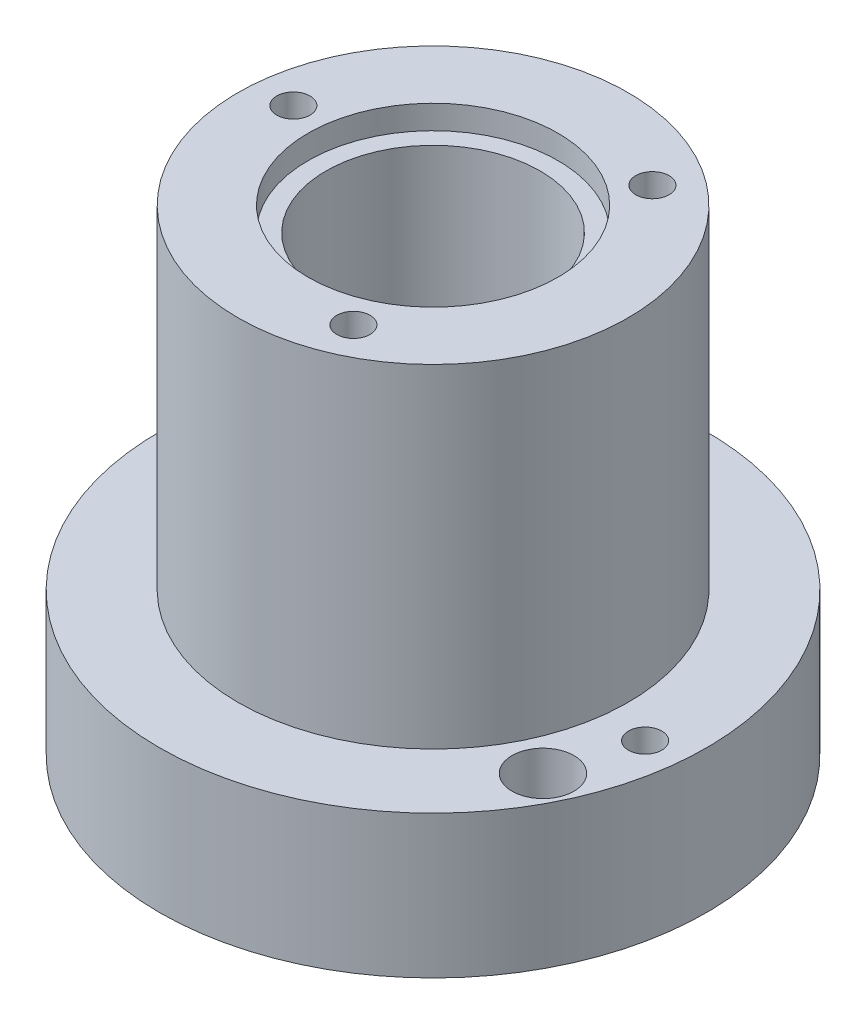
ISO-10303-21;
HEADER;
FILE_DESCRIPTION(('STEP AP214'),'2;1');
FILE_NAME('part.step','',(''),(''),'','','');
FILE_SCHEMA(('AUTOMOTIVE_DESIGN { 1 0 10303 214 1 1 1 1 }'));
ENDSEC;
DATA;
#1=APPLICATION_CONTEXT('core data for automotive mechanical design processes');
#2=APPLICATION_PROTOCOL_DEFINITION('international standard','automotive_design',2000,#1);
#3=PRODUCT_CONTEXT('',#1,'mechanical');
#4=PRODUCT('Part','Part','',(#3));
#5=PRODUCT_RELATED_PRODUCT_CATEGORY('part','',(#4));
#6=PRODUCT_DEFINITION_FORMATION('','',#4);
#7=PRODUCT_DEFINITION_CONTEXT('part definition',#1,'design');
#8=PRODUCT_DEFINITION('design','',#6,#7);
#9=PRODUCT_DEFINITION_SHAPE('','',#8);
#10=(LENGTH_UNIT() NAMED_UNIT(*) SI_UNIT(.MILLI.,.METRE.));
#11=(NAMED_UNIT(*) PLANE_ANGLE_UNIT() SI_UNIT($,.RADIAN.));
#12=(NAMED_UNIT(*) SI_UNIT($,.STERADIAN.) SOLID_ANGLE_UNIT());
#13=UNCERTAINTY_MEASURE_WITH_UNIT(LENGTH_MEASURE(1.E-05),#10,'distance_accuracy_value','');
#14=(GEOMETRIC_REPRESENTATION_CONTEXT(3) GLOBAL_UNCERTAINTY_ASSIGNED_CONTEXT((#13)) GLOBAL_UNIT_ASSIGNED_CONTEXT((#10,
#11,#12)) REPRESENTATION_CONTEXT('',''));
#15=CARTESIAN_POINT('',(0.,0.,0.));
#16=DIRECTION('',(0.,0.,1.));
#17=DIRECTION('',(1.,0.,0.));
#18=AXIS2_PLACEMENT_3D('',#15,#16,#17);
#19=CARTESIAN_POINT('',(13.0281539228037,25.4,14.3830452707903));
#20=DIRECTION('',(0.,-1.,0.));
#21=DIRECTION('',(0.,0.,-1.));
#22=AXIS2_PLACEMENT_3D('',#19,#20,#21);
#23=CYLINDRICAL_SURFACE('',#22,14.605);
#24=CARTESIAN_POINT('',(13.0281539228037,0.,14.3830452707903));
#25=DIRECTION('',(0.,1.,0.));
#26=DIRECTION('',(0.,0.,1.));
#27=AXIS2_PLACEMENT_3D('',#24,#25,#26);
#28=CIRCLE('',#27,14.605);
#29=CARTESIAN_POINT('',(13.0281539228037,0.,28.9880452707903));
#30=VERTEX_POINT('',#29);
#31=EDGE_CURVE('E12',#30,#30,#28,.T.);
#32=ORIENTED_EDGE('',*,*,#31,.T.);
#33=EDGE_LOOP('',(#32));
#34=FACE_BOUND('',#33,.T.);
#35=CARTESIAN_POINT('',(13.0281539228037,7.62,14.3830452707903));
#36=DIRECTION('',(0.,1.,0.));
#37=DIRECTION('',(0.,0.,1.));
#38=AXIS2_PLACEMENT_3D('',#35,#36,#37);
#39=CIRCLE('',#38,14.605);
#40=CARTESIAN_POINT('',(13.0281539228037,7.62,28.9880452707903));
#41=VERTEX_POINT('',#40);
#42=EDGE_CURVE('E141',#41,#41,#39,.T.);
#43=ORIENTED_EDGE('',*,*,#42,.F.);
#44=EDGE_LOOP('',(#43));
#45=FACE_BOUND('',#44,.T.);
#46=ADVANCED_FACE('F40',(#34,#45),#23,.T.);
#47=CARTESIAN_POINT('',(13.0281539228037,25.4,14.3830452707903));
#48=DIRECTION('',(0.,1.,0.));
#49=DIRECTION('',(0.,0.,1.));
#50=AXIS2_PLACEMENT_3D('',#47,#48,#49);
#51=PLANE('',#50);
#52=CARTESIAN_POINT('',(16.4348390463682,25.4,22.0415320971081));
#53=DIRECTION('',(0.,1.,0.));
#54=DIRECTION('',(0.,0.,1.));
#55=AXIS2_PLACEMENT_3D('',#52,#53,#54);
#56=CIRCLE('',#55,0.889000000000001);
#57=CARTESIAN_POINT('',(16.4348390463682,25.4,22.9305320971081));
#58=VERTEX_POINT('',#57);
#59=EDGE_CURVE('E119',#58,#58,#56,.T.);
#60=ORIENTED_EDGE('',*,*,#59,.F.);
#61=EDGE_LOOP('',(#60));
#62=FACE_BOUND('',#61,.T.);
#63=CARTESIAN_POINT('',(17.9572555071611,25.4,7.60352599792991));
#64=DIRECTION('',(0.,1.,0.));
#65=DIRECTION('',(0.,0.,1.));
#66=AXIS2_PLACEMENT_3D('',#63,#64,#65);
#67=CIRCLE('',#66,0.889000000000001);
#68=CARTESIAN_POINT('',(17.9572555071611,25.4,8.49252599792991));
#69=VERTEX_POINT('',#68);
#70=EDGE_CURVE('E125',#69,#69,#67,.T.);
#71=ORIENTED_EDGE('',*,*,#70,.F.);
#72=EDGE_LOOP('',(#71));
#73=FACE_BOUND('',#72,.T.);
#74=CARTESIAN_POINT('',(4.69236721488166,25.4,13.5040777173328));
#75=DIRECTION('',(0.,1.,0.));
#76=DIRECTION('',(0.,0.,1.));
#77=AXIS2_PLACEMENT_3D('',#74,#75,#76);
#78=CIRCLE('',#77,0.889);
#79=CARTESIAN_POINT('',(4.69236721488166,25.4,14.3930777173328));
#80=VERTEX_POINT('',#79);
#81=EDGE_CURVE('E131',#80,#80,#78,.T.);
#82=ORIENTED_EDGE('',*,*,#81,.F.);
#83=EDGE_LOOP('',(#82));
#84=FACE_BOUND('',#83,.T.);
#85=CARTESIAN_POINT('',(13.0281539228037,25.4,14.3830452707903));
#86=DIRECTION('',(0.,1.,0.));
#87=DIRECTION('',(0.,0.,1.));
#88=AXIS2_PLACEMENT_3D('',#85,#86,#87);
#89=CIRCLE('',#88,6.6675);
#90=CARTESIAN_POINT('',(13.0281539228037,25.4,21.0505452707903));
#91=VERTEX_POINT('',#90);
#92=EDGE_CURVE('E148',#91,#91,#89,.T.);
#93=ORIENTED_EDGE('',*,*,#92,.F.);
#94=EDGE_LOOP('',(#93));
#95=FACE_BOUND('',#94,.T.);
#96=CARTESIAN_POINT('',(13.0281539228037,25.4,14.3830452707903));
#97=DIRECTION('',(0.,1.,0.));
#98=DIRECTION('',(0.,0.,1.));
#99=AXIS2_PLACEMENT_3D('',#96,#97,#98);
#100=CIRCLE('',#99,10.414);
#101=CARTESIAN_POINT('',(13.0281539228037,25.4,24.7970452707903));
#102=VERTEX_POINT('',#101);
#103=EDGE_CURVE('E137',#102,#102,#100,.T.);
#104=ORIENTED_EDGE('',*,*,#103,.T.);
#105=EDGE_LOOP('',(#104));
#106=FACE_BOUND('',#105,.T.);
#107=ADVANCED_FACE('F174',(#62,#73,#84,#95,#106),#51,.T.);
#108=CARTESIAN_POINT('',(13.0281539228037,0.,14.3830452707903));
#109=DIRECTION('',(0.,1.,0.));
#110=DIRECTION('',(0.,0.,1.));
#111=AXIS2_PLACEMENT_3D('',#108,#109,#110);
#112=CYLINDRICAL_SURFACE('',#111,5.715);
#113=CARTESIAN_POINT('',(13.0281539228037,0.,14.3830452707903));
#114=DIRECTION('',(0.,1.,0.));
#115=DIRECTION('',(0.,0.,1.));
#116=AXIS2_PLACEMENT_3D('',#113,#114,#115);
#117=CIRCLE('',#116,5.715);
#118=CARTESIAN_POINT('',(13.0281539228037,0.,20.0980452707903));
#119=VERTEX_POINT('',#118);
#120=EDGE_CURVE('E48',#119,#119,#117,.T.);
#121=ORIENTED_EDGE('',*,*,#120,.F.);
#122=EDGE_LOOP('',(#121));
#123=FACE_BOUND('',#122,.T.);
#124=CARTESIAN_POINT('',(13.0281539228037,24.13,14.3830452707903));
#125=DIRECTION('',(0.,1.,0.));
#126=DIRECTION('',(0.,0.,1.));
#127=AXIS2_PLACEMENT_3D('',#124,#125,#126);
#128=CIRCLE('',#127,5.715);
#129=CARTESIAN_POINT('',(13.0281539228037,24.13,20.0980452707903));
#130=VERTEX_POINT('',#129);
#131=EDGE_CURVE('E147',#130,#130,#128,.F.);
#132=ORIENTED_EDGE('',*,*,#131,.F.);
#133=EDGE_LOOP('',(#132));
#134=FACE_BOUND('',#133,.T.);
#135=ADVANCED_FACE('F179',(#123,#134),#112,.F.);
#136=CARTESIAN_POINT('',(13.0281539228037,0.,14.3830452707903));
#137=DIRECTION('',(0.,1.,0.));
#138=DIRECTION('',(0.,0.,1.));
#139=AXIS2_PLACEMENT_3D('',#136,#137,#138);
#140=PLANE('',#139);
#141=CARTESIAN_POINT('',(25.6601759592949,0.,15.6953025891544));
#142=DIRECTION('',(0.,-1.,0.));
#143=DIRECTION('',(0.,0.,-1.));
#144=AXIS2_PLACEMENT_3D('',#141,#142,#143);
#145=CIRCLE('',#144,0.888999999999987);
#146=CARTESIAN_POINT('',(25.6601759592949,0.,14.8063025891544));
#147=VERTEX_POINT('',#146);
#148=EDGE_CURVE('E278',#147,#147,#145,.T.);
#149=ORIENTED_EDGE('',*,*,#148,.F.);
#150=EDGE_LOOP('',(#149));
#151=FACE_BOUND('',#150,.T.);
#152=CARTESIAN_POINT('',(0.396131886312438,0.,13.0707879524261));
#153=DIRECTION('',(0.,-1.,0.));
#154=DIRECTION('',(0.,0.,-1.));
#155=AXIS2_PLACEMENT_3D('',#152,#153,#154);
#156=CIRCLE('',#155,0.888999999999987);
#157=CARTESIAN_POINT('',(0.396131886312438,0.,12.1817879524261));
#158=VERTEX_POINT('',#157);
#159=EDGE_CURVE('E282',#158,#158,#156,.T.);
#160=ORIENTED_EDGE('',*,*,#159,.F.);
#161=EDGE_LOOP('',(#160));
#162=FACE_BOUND('',#161,.T.);
#163=CARTESIAN_POINT('',(5.82740256425499,0.,15.2376598659039));
#164=DIRECTION('',(0.,-1.,0.));
#165=DIRECTION('',(0.,0.,-1.));
#166=AXIS2_PLACEMENT_3D('',#163,#164,#165);
#167=CIRCLE('',#166,0.595629999999989);
#168=CARTESIAN_POINT('',(5.82740256425499,0.,14.6420298659039));
#169=VERTEX_POINT('',#168);
#170=EDGE_CURVE('E82',#169,#169,#167,.T.);
#171=ORIENTED_EDGE('',*,*,#170,.F.);
#172=EDGE_LOOP('',(#171));
#173=FACE_BOUND('',#172,.T.);
#174=CARTESIAN_POINT('',(5.82740256425499,0.,19.0476598659039));
#175=DIRECTION('',(0.,-1.,0.));
#176=DIRECTION('',(0.,0.,-1.));
#177=AXIS2_PLACEMENT_3D('',#174,#175,#176);
#178=CIRCLE('',#177,0.595629999999989);
#179=CARTESIAN_POINT('',(5.82740256425499,0.,18.4520298659039));
#180=VERTEX_POINT('',#179);
#181=EDGE_CURVE('E81',#180,#180,#178,.T.);
#182=ORIENTED_EDGE('',*,*,#181,.F.);
#183=EDGE_LOOP('',(#182));
#184=FACE_BOUND('',#183,.T.);
#185=CARTESIAN_POINT('',(5.82740256425499,0.,17.1426598659039));
#186=DIRECTION('',(0.,-1.,0.));
#187=DIRECTION('',(0.,0.,-1.));
#188=AXIS2_PLACEMENT_3D('',#185,#186,#187);
#189=CIRCLE('',#188,0.79375);
#190=CARTESIAN_POINT('',(5.82740256425499,0.,16.3489098659039));
#191=VERTEX_POINT('',#190);
#192=EDGE_CURVE('E94',#191,#191,#189,.T.);
#193=ORIENTED_EDGE('',*,*,#192,.F.);
#194=EDGE_LOOP('',(#193));
#195=FACE_BOUND('',#194,.T.);
#196=CARTESIAN_POINT('',(24.4495533797354,0.,19.9365697773716));
#197=DIRECTION('',(0.,-1.,0.));
#198=DIRECTION('',(0.,0.,1.));
#199=AXIS2_PLACEMENT_3D('',#196,#197,#198);
#200=CIRCLE('',#199,1.651);
#201=CARTESIAN_POINT('',(24.4495533797354,0.,18.2855697773716));
#202=VERTEX_POINT('',#201);
#203=EDGE_CURVE('E98',#202,#202,#200,.T.);
#204=ORIENTED_EDGE('',*,*,#203,.F.);
#205=EDGE_LOOP('',(#204));
#206=FACE_BOUND('',#205,.T.);
#207=CARTESIAN_POINT('',(1.60675446587194,0.,8.82952076420888));
#208=DIRECTION('',(0.,-1.,0.));
#209=DIRECTION('',(0.,0.,-1.));
#210=AXIS2_PLACEMENT_3D('',#207,#208,#209);
#211=CIRCLE('',#210,1.651);
#212=CARTESIAN_POINT('',(1.60675446587194,0.,7.17852076420888));
#213=VERTEX_POINT('',#212);
#214=EDGE_CURVE('E103',#213,#213,#211,.T.);
#215=ORIENTED_EDGE('',*,*,#214,.F.);
#216=EDGE_LOOP('',(#215));
#217=FACE_BOUND('',#216,.T.);
#218=CARTESIAN_POINT('',(17.8930413905689,0.,4.37789934651808));
#219=DIRECTION('',(0.,-1.,0.));
#220=DIRECTION('',(0.,0.,-1.));
#221=AXIS2_PLACEMENT_3D('',#218,#219,#220);
#222=CIRCLE('',#221,1.35255);
#223=CARTESIAN_POINT('',(17.8930413905689,0.,3.02534934651807));
#224=VERTEX_POINT('',#223);
#225=EDGE_CURVE('E107',#224,#224,#222,.T.);
#226=ORIENTED_EDGE('',*,*,#225,.F.);
#227=EDGE_LOOP('',(#226));
#228=FACE_BOUND('',#227,.T.);
#229=CARTESIAN_POINT('',(8.16326645503836,0.,24.3881911950625));
#230=DIRECTION('',(0.,-1.,0.));
#231=DIRECTION('',(0.,0.,-1.));
#232=AXIS2_PLACEMENT_3D('',#229,#230,#231);
#233=CIRCLE('',#232,1.35255);
#234=CARTESIAN_POINT('',(8.16326645503836,0.,23.0356411950624));
#235=VERTEX_POINT('',#234);
#236=EDGE_CURVE('E113',#235,#235,#233,.T.);
#237=ORIENTED_EDGE('',*,*,#236,.F.);
#238=EDGE_LOOP('',(#237));
#239=FACE_BOUND('',#238,.T.);
#240=ORIENTED_EDGE('',*,*,#120,.T.);
#241=EDGE_LOOP('',(#240));
#242=FACE_BOUND('',#241,.T.);
#243=ORIENTED_EDGE('',*,*,#31,.F.);
#244=EDGE_LOOP('',(#243));
#245=FACE_BOUND('',#244,.T.);
#246=ADVANCED_FACE('F184',(#151,#162,#173,#184,#195,#206,#217,#228,#239,#242,#245),#140,.F.);
#247=CARTESIAN_POINT('',(13.0281539228037,24.13,14.3830452707903));
#248=DIRECTION('',(0.,1.,0.));
#249=DIRECTION('',(0.,0.,1.));
#250=AXIS2_PLACEMENT_3D('',#247,#248,#249);
#251=PLANE('',#250);
#252=CARTESIAN_POINT('',(13.0281539228037,24.13,14.3830452707903));
#253=DIRECTION('',(0.,1.,0.));
#254=DIRECTION('',(0.,0.,1.));
#255=AXIS2_PLACEMENT_3D('',#252,#253,#254);
#256=CIRCLE('',#255,6.6675);
#257=CARTESIAN_POINT('',(13.0281539228037,24.13,21.0505452707903));
#258=VERTEX_POINT('',#257);
#259=EDGE_CURVE('E144',#258,#258,#256,.T.);
#260=ORIENTED_EDGE('',*,*,#259,.T.);
#261=EDGE_LOOP('',(#260));
#262=FACE_BOUND('',#261,.T.);
#263=ORIENTED_EDGE('',*,*,#131,.T.);
#264=EDGE_LOOP('',(#263));
#265=FACE_BOUND('',#264,.T.);
#266=ADVANCED_FACE('F186',(#262,#265),#251,.T.);
#267=CARTESIAN_POINT('',(13.0281539228037,24.13,14.3830452707903));
#268=DIRECTION('',(0.,1.,0.));
#269=DIRECTION('',(0.,0.,1.));
#270=AXIS2_PLACEMENT_3D('',#267,#268,#269);
#271=CYLINDRICAL_SURFACE('',#270,6.6675);
#272=ORIENTED_EDGE('',*,*,#259,.F.);
#273=EDGE_LOOP('',(#272));
#274=FACE_BOUND('',#273,.T.);
#275=ORIENTED_EDGE('',*,*,#92,.T.);
#276=EDGE_LOOP('',(#275));
#277=FACE_BOUND('',#276,.T.);
#278=ADVANCED_FACE('F166',(#274,#277),#271,.F.);
#279=CARTESIAN_POINT('',(13.0281539228037,7.62,14.3830452707903));
#280=DIRECTION('',(0.,1.,0.));
#281=DIRECTION('',(0.,0.,1.));
#282=AXIS2_PLACEMENT_3D('',#279,#280,#281);
#283=PLANE('',#282);
#284=CARTESIAN_POINT('',(25.6601759592949,7.62,15.6953025891544));
#285=DIRECTION('',(0.,1.,0.));
#286=DIRECTION('',(0.,0.,1.));
#287=AXIS2_PLACEMENT_3D('',#284,#285,#286);
#288=CIRCLE('',#287,0.888999999999992);
#289=CARTESIAN_POINT('',(25.6601759592949,7.62,16.5843025891544));
#290=VERTEX_POINT('',#289);
#291=EDGE_CURVE('E281',#290,#290,#288,.T.);
#292=ORIENTED_EDGE('',*,*,#291,.F.);
#293=EDGE_LOOP('',(#292));
#294=FACE_BOUND('',#293,.T.);
#295=CARTESIAN_POINT('',(0.396131886312438,7.62,13.0707879524261));
#296=DIRECTION('',(0.,1.,0.));
#297=DIRECTION('',(0.,0.,1.));
#298=AXIS2_PLACEMENT_3D('',#295,#296,#297);
#299=CIRCLE('',#298,0.888999999999993);
#300=CARTESIAN_POINT('',(0.396131886312438,7.62,13.9597879524261));
#301=VERTEX_POINT('',#300);
#302=EDGE_CURVE('E88',#301,#301,#299,.T.);
#303=ORIENTED_EDGE('',*,*,#302,.F.);
#304=EDGE_LOOP('',(#303));
#305=FACE_BOUND('',#304,.T.);
#306=CARTESIAN_POINT('',(24.4495533797354,7.62,19.9365697773716));
#307=DIRECTION('',(0.,1.,0.));
#308=DIRECTION('',(0.,0.,1.));
#309=AXIS2_PLACEMENT_3D('',#306,#307,#308);
#310=CIRCLE('',#309,1.651);
#311=CARTESIAN_POINT('',(24.4495533797354,7.62,18.2855697773716));
#312=VERTEX_POINT('',#311);
#313=EDGE_CURVE('E43',#312,#312,#310,.T.);
#314=ORIENTED_EDGE('',*,*,#313,.F.);
#315=EDGE_LOOP('',(#314));
#316=FACE_BOUND('',#315,.T.);
#317=CARTESIAN_POINT('',(1.60675446587194,7.62,8.82952076420888));
#318=DIRECTION('',(0.,1.,0.));
#319=DIRECTION('',(0.,0.,1.));
#320=AXIS2_PLACEMENT_3D('',#317,#318,#319);
#321=CIRCLE('',#320,1.651);
#322=CARTESIAN_POINT('',(1.60675446587194,7.62,7.17852076420888));
#323=VERTEX_POINT('',#322);
#324=EDGE_CURVE('E106',#323,#323,#321,.T.);
#325=ORIENTED_EDGE('',*,*,#324,.F.);
#326=EDGE_LOOP('',(#325));
#327=FACE_BOUND('',#326,.T.);
#328=CARTESIAN_POINT('',(13.0281539228037,7.62,14.3830452707903));
#329=DIRECTION('',(0.,1.,0.));
#330=DIRECTION('',(0.,0.,1.));
#331=AXIS2_PLACEMENT_3D('',#328,#329,#330);
#332=CIRCLE('',#331,10.414);
#333=CARTESIAN_POINT('',(13.0281539228037,7.62,24.7970452707903));
#334=VERTEX_POINT('',#333);
#335=EDGE_CURVE('E138',#334,#334,#332,.T.);
#336=ORIENTED_EDGE('',*,*,#335,.F.);
#337=EDGE_LOOP('',(#336));
#338=FACE_BOUND('',#337,.T.);
#339=ORIENTED_EDGE('',*,*,#42,.T.);
#340=EDGE_LOOP('',(#339));
#341=FACE_BOUND('',#340,.T.);
#342=ADVANCED_FACE('F162',(#294,#305,#316,#327,#338,#341),#283,.T.);
#343=CARTESIAN_POINT('',(13.0281539228037,7.62,14.3830452707903));
#344=DIRECTION('',(0.,1.,0.));
#345=DIRECTION('',(0.,0.,1.));
#346=AXIS2_PLACEMENT_3D('',#343,#344,#345);
#347=CYLINDRICAL_SURFACE('',#346,10.414);
#348=ORIENTED_EDGE('',*,*,#335,.T.);
#349=EDGE_LOOP('',(#348));
#350=FACE_BOUND('',#349,.T.);
#351=ORIENTED_EDGE('',*,*,#103,.F.);
#352=EDGE_LOOP('',(#351));
#353=FACE_BOUND('',#352,.T.);
#354=ADVANCED_FACE('F165',(#350,#353),#347,.T.);
#355=CARTESIAN_POINT('',(4.69236721488166,22.86,13.5040777173328));
#356=DIRECTION('',(0.,1.,0.));
#357=DIRECTION('',(0.,0.,1.));
#358=AXIS2_PLACEMENT_3D('',#355,#356,#357);
#359=CONICAL_SURFACE('',#358,0.888999999999999,1.02974425867665);
#360=CARTESIAN_POINT('',(4.69236721488166,22.3258349096845,13.5040777173328));
#361=VERTEX_POINT('',#360);
#362=VERTEX_LOOP('',#361);
#363=FACE_BOUND('',#362,.T.);
#364=CARTESIAN_POINT('',(4.69236721488166,22.86,13.5040777173328));
#365=DIRECTION('',(0.,1.,0.));
#366=DIRECTION('',(0.,0.,1.));
#367=AXIS2_PLACEMENT_3D('',#364,#365,#366);
#368=CIRCLE('',#367,0.888999999999999);
#369=CARTESIAN_POINT('',(4.69236721488166,22.86,14.3930777173328));
#370=VERTEX_POINT('',#369);
#371=EDGE_CURVE('E134',#370,#370,#368,.T.);
#372=ORIENTED_EDGE('',*,*,#371,.T.);
#373=EDGE_LOOP('',(#372));
#374=FACE_BOUND('',#373,.T.);
#375=ADVANCED_FACE('F205',(#363,#374),#359,.F.);
#376=CARTESIAN_POINT('',(4.69236721488166,25.4,13.5040777173328));
#377=DIRECTION('',(0.,1.,0.));
#378=DIRECTION('',(0.,0.,1.));
#379=AXIS2_PLACEMENT_3D('',#376,#377,#378);
#380=CYLINDRICAL_SURFACE('',#379,0.889);
#381=ORIENTED_EDGE('',*,*,#371,.F.);
#382=EDGE_LOOP('',(#381));
#383=FACE_BOUND('',#382,.T.);
#384=ORIENTED_EDGE('',*,*,#81,.T.);
#385=EDGE_LOOP('',(#384));
#386=FACE_BOUND('',#385,.T.);
#387=ADVANCED_FACE('F209',(#383,#386),#380,.F.);
#388=CARTESIAN_POINT('',(17.9572555071611,22.86,7.60352599792991));
#389=DIRECTION('',(0.,1.,0.));
#390=DIRECTION('',(0.,0.,1.));
#391=AXIS2_PLACEMENT_3D('',#388,#389,#390);
#392=CONICAL_SURFACE('',#391,0.889000000000001,1.02974425867665);
#393=CARTESIAN_POINT('',(17.9572555071611,22.3258349096845,7.60352599792991));
#394=VERTEX_POINT('',#393);
#395=VERTEX_LOOP('',#394);
#396=FACE_BOUND('',#395,.T.);
#397=CARTESIAN_POINT('',(17.9572555071611,22.86,7.60352599792991));
#398=DIRECTION('',(0.,1.,0.));
#399=DIRECTION('',(0.,0.,1.));
#400=AXIS2_PLACEMENT_3D('',#397,#398,#399);
#401=CIRCLE('',#400,0.889000000000001);
#402=CARTESIAN_POINT('',(17.9572555071611,22.86,8.49252599792991));
#403=VERTEX_POINT('',#402);
#404=EDGE_CURVE('E128',#403,#403,#401,.T.);
#405=ORIENTED_EDGE('',*,*,#404,.T.);
#406=EDGE_LOOP('',(#405));
#407=FACE_BOUND('',#406,.T.);
#408=ADVANCED_FACE('F212',(#396,#407),#392,.F.);
#409=CARTESIAN_POINT('',(17.9572555071611,25.4,7.60352599792991));
#410=DIRECTION('',(0.,1.,0.));
#411=DIRECTION('',(0.,0.,1.));
#412=AXIS2_PLACEMENT_3D('',#409,#410,#411);
#413=CYLINDRICAL_SURFACE('',#412,0.889000000000001);
#414=ORIENTED_EDGE('',*,*,#404,.F.);
#415=EDGE_LOOP('',(#414));
#416=FACE_BOUND('',#415,.T.);
#417=ORIENTED_EDGE('',*,*,#70,.T.);
#418=EDGE_LOOP('',(#417));
#419=FACE_BOUND('',#418,.T.);
#420=ADVANCED_FACE('F216',(#416,#419),#413,.F.);
#421=CARTESIAN_POINT('',(16.4348390463682,22.86,22.0415320971081));
#422=DIRECTION('',(0.,1.,0.));
#423=DIRECTION('',(0.,0.,1.));
#424=AXIS2_PLACEMENT_3D('',#421,#422,#423);
#425=CONICAL_SURFACE('',#424,0.889000000000001,1.02974425867665);
#426=CARTESIAN_POINT('',(16.4348390463682,22.3258349096845,22.0415320971081));
#427=VERTEX_POINT('',#426);
#428=VERTEX_LOOP('',#427);
#429=FACE_BOUND('',#428,.T.);
#430=CARTESIAN_POINT('',(16.4348390463682,22.86,22.0415320971081));
#431=DIRECTION('',(0.,1.,0.));
#432=DIRECTION('',(0.,0.,1.));
#433=AXIS2_PLACEMENT_3D('',#430,#431,#432);
#434=CIRCLE('',#433,0.889000000000001);
#435=CARTESIAN_POINT('',(16.4348390463682,22.86,22.9305320971081));
#436=VERTEX_POINT('',#435);
#437=EDGE_CURVE('E122',#436,#436,#434,.T.);
#438=ORIENTED_EDGE('',*,*,#437,.T.);
#439=EDGE_LOOP('',(#438));
#440=FACE_BOUND('',#439,.T.);
#441=ADVANCED_FACE('F219',(#429,#440),#425,.F.);
#442=CARTESIAN_POINT('',(16.4348390463682,25.4,22.0415320971081));
#443=DIRECTION('',(0.,1.,0.));
#444=DIRECTION('',(0.,0.,1.));
#445=AXIS2_PLACEMENT_3D('',#442,#443,#444);
#446=CYLINDRICAL_SURFACE('',#445,0.889000000000001);
#447=ORIENTED_EDGE('',*,*,#437,.F.);
#448=EDGE_LOOP('',(#447));
#449=FACE_BOUND('',#448,.T.);
#450=ORIENTED_EDGE('',*,*,#59,.T.);
#451=EDGE_LOOP('',(#450));
#452=FACE_BOUND('',#451,.T.);
#453=ADVANCED_FACE('F223',(#449,#452),#446,.F.);
#454=CARTESIAN_POINT('',(8.16326645503836,4.0005,24.3881911950625));
#455=DIRECTION('',(0.,-1.,0.));
#456=DIRECTION('',(0.,0.,-1.));
#457=AXIS2_PLACEMENT_3D('',#454,#455,#456);
#458=CONICAL_SURFACE('',#457,1.35255,1.02974425867665);
#459=CARTESIAN_POINT('',(8.16326645503836,4.81319403026573,24.3881911950625));
#460=VERTEX_POINT('',#459);
#461=VERTEX_LOOP('',#460);
#462=FACE_BOUND('',#461,.T.);
#463=CARTESIAN_POINT('',(8.16326645503836,4.0005,24.3881911950625));
#464=DIRECTION('',(0.,-1.,0.));
#465=DIRECTION('',(0.,0.,-1.));
#466=AXIS2_PLACEMENT_3D('',#463,#464,#465);
#467=CIRCLE('',#466,1.35255);
#468=CARTESIAN_POINT('',(8.16326645503836,4.0005,23.0356411950624));
#469=VERTEX_POINT('',#468);
#470=EDGE_CURVE('E116',#469,#469,#467,.T.);
#471=ORIENTED_EDGE('',*,*,#470,.T.);
#472=EDGE_LOOP('',(#471));
#473=FACE_BOUND('',#472,.T.);
#474=ADVANCED_FACE('F227',(#462,#473),#458,.F.);
#475=CARTESIAN_POINT('',(8.16326645503836,0.,24.3881911950625));
#476=DIRECTION('',(0.,-1.,0.));
#477=DIRECTION('',(0.,0.,-1.));
#478=AXIS2_PLACEMENT_3D('',#475,#476,#477);
#479=CYLINDRICAL_SURFACE('',#478,1.35255);
#480=ORIENTED_EDGE('',*,*,#470,.F.);
#481=EDGE_LOOP('',(#480));
#482=FACE_BOUND('',#481,.T.);
#483=ORIENTED_EDGE('',*,*,#236,.T.);
#484=EDGE_LOOP('',(#483));
#485=FACE_BOUND('',#484,.T.);
#486=ADVANCED_FACE('F231',(#482,#485),#479,.F.);
#487=CARTESIAN_POINT('',(17.8930413905689,4.0005,4.37789934651808));
#488=DIRECTION('',(0.,-1.,0.));
#489=DIRECTION('',(0.,0.,-1.));
#490=AXIS2_PLACEMENT_3D('',#487,#488,#489);
#491=CONICAL_SURFACE('',#490,1.35255,1.02974425867665);
#492=CARTESIAN_POINT('',(17.8930413905689,4.81319403026573,4.37789934651808));
#493=VERTEX_POINT('',#492);
#494=VERTEX_LOOP('',#493);
#495=FACE_BOUND('',#494,.T.);
#496=CARTESIAN_POINT('',(17.8930413905689,4.0005,4.37789934651808));
#497=DIRECTION('',(0.,-1.,0.));
#498=DIRECTION('',(0.,0.,-1.));
#499=AXIS2_PLACEMENT_3D('',#496,#497,#498);
#500=CIRCLE('',#499,1.35255);
#501=CARTESIAN_POINT('',(17.8930413905689,4.0005,3.02534934651808));
#502=VERTEX_POINT('',#501);
#503=EDGE_CURVE('E110',#502,#502,#500,.T.);
#504=ORIENTED_EDGE('',*,*,#503,.T.);
#505=EDGE_LOOP('',(#504));
#506=FACE_BOUND('',#505,.T.);
#507=ADVANCED_FACE('F235',(#495,#506),#491,.F.);
#508=CARTESIAN_POINT('',(17.8930413905689,0.,4.37789934651808));
#509=DIRECTION('',(0.,-1.,0.));
#510=DIRECTION('',(0.,0.,-1.));
#511=AXIS2_PLACEMENT_3D('',#508,#509,#510);
#512=CYLINDRICAL_SURFACE('',#511,1.35255);
#513=ORIENTED_EDGE('',*,*,#503,.F.);
#514=EDGE_LOOP('',(#513));
#515=FACE_BOUND('',#514,.T.);
#516=ORIENTED_EDGE('',*,*,#225,.T.);
#517=EDGE_LOOP('',(#516));
#518=FACE_BOUND('',#517,.T.);
#519=ADVANCED_FACE('F239',(#515,#518),#512,.F.);
#520=CARTESIAN_POINT('',(1.60675446587194,8.89,8.82952076420888));
#521=DIRECTION('',(0.,-1.,0.));
#522=DIRECTION('',(0.,0.,-1.));
#523=AXIS2_PLACEMENT_3D('',#520,#521,#522);
#524=CYLINDRICAL_SURFACE('',#523,1.651);
#525=CARTESIAN_POINT('',(1.60675446587194,7.62,7.17852076420888));
#526=CARTESIAN_POINT('',(1.60675446587194,7.540625,7.17852076420888));
#527=CARTESIAN_POINT('',(1.60675446587194,7.46125,7.17852076420888));
#528=CARTESIAN_POINT('',(1.60675446587194,7.3025,7.17852076420888));
#529=CARTESIAN_POINT('',(1.60675446587194,7.223125,7.17852076420888));
#530=CARTESIAN_POINT('',(1.60675446587194,7.064375,7.17852076420888));
#531=CARTESIAN_POINT('',(1.60675446587194,6.985,7.17852076420888));
#532=CARTESIAN_POINT('',(1.60675446587194,6.82625,7.17852076420888));
#533=CARTESIAN_POINT('',(1.60675446587194,6.746875,7.17852076420888));
#534=CARTESIAN_POINT('',(1.60675446587194,6.588125,7.17852076420888));
#535=CARTESIAN_POINT('',(1.60675446587194,6.50875,7.17852076420888));
#536=CARTESIAN_POINT('',(1.60675446587194,6.35,7.17852076420888));
#537=CARTESIAN_POINT('',(1.60675446587194,6.270625,7.17852076420888));
#538=CARTESIAN_POINT('',(1.60675446587194,6.111875,7.17852076420888));
#539=CARTESIAN_POINT('',(1.60675446587194,6.0325,7.17852076420888));
#540=CARTESIAN_POINT('',(1.60675446587194,5.87375,7.17852076420888));
#541=CARTESIAN_POINT('',(1.60675446587194,5.794375,7.17852076420888));
#542=CARTESIAN_POINT('',(1.60675446587194,5.635625,7.17852076420888));
#543=CARTESIAN_POINT('',(1.60675446587194,5.55625,7.17852076420888));
#544=CARTESIAN_POINT('',(1.60675446587194,5.3975,7.17852076420888));
#545=CARTESIAN_POINT('',(1.60675446587194,5.318125,7.17852076420888));
#546=CARTESIAN_POINT('',(1.60675446587194,5.159375,7.17852076420888));
#547=CARTESIAN_POINT('',(1.60675446587194,5.08,7.17852076420888));
#548=CARTESIAN_POINT('',(1.60675446587194,4.92125,7.17852076420888));
#549=CARTESIAN_POINT('',(1.60675446587194,4.841875,7.17852076420888));
#550=CARTESIAN_POINT('',(1.60675446587194,4.683125,7.17852076420888));
#551=CARTESIAN_POINT('',(1.60675446587194,4.60375,7.17852076420888));
#552=CARTESIAN_POINT('',(1.60675446587194,4.445,7.17852076420888));
#553=CARTESIAN_POINT('',(1.60675446587194,4.365625,7.17852076420888));
#554=CARTESIAN_POINT('',(1.60675446587194,4.206875,7.17852076420888));
#555=CARTESIAN_POINT('',(1.60675446587194,4.1275,7.17852076420888));
#556=CARTESIAN_POINT('',(1.60675446587194,3.96875,7.17852076420888));
#557=CARTESIAN_POINT('',(1.60675446587194,3.889375,7.17852076420888));
#558=CARTESIAN_POINT('',(1.60675446587194,3.730625,7.17852076420888));
#559=CARTESIAN_POINT('',(1.60675446587194,3.65125,7.17852076420888));
#560=CARTESIAN_POINT('',(1.60675446587194,3.4925,7.17852076420888));
#561=CARTESIAN_POINT('',(1.60675446587194,3.413125,7.17852076420888));
#562=CARTESIAN_POINT('',(1.60675446587194,3.254375,7.17852076420888));
#563=CARTESIAN_POINT('',(1.60675446587194,3.175,7.17852076420888));
#564=CARTESIAN_POINT('',(1.60675446587194,3.01625,7.17852076420888));
#565=CARTESIAN_POINT('',(1.60675446587194,2.936875,7.17852076420888));
#566=CARTESIAN_POINT('',(1.60675446587194,2.778125,7.17852076420888));
#567=CARTESIAN_POINT('',(1.60675446587194,2.69875,7.17852076420888));
#568=CARTESIAN_POINT('',(1.60675446587194,2.54,7.17852076420888));
#569=CARTESIAN_POINT('',(1.60675446587194,2.460625,7.17852076420888));
#570=CARTESIAN_POINT('',(1.60675446587194,2.301875,7.17852076420888));
#571=CARTESIAN_POINT('',(1.60675446587194,2.2225,7.17852076420888));
#572=CARTESIAN_POINT('',(1.60675446587194,2.06375,7.17852076420888));
#573=CARTESIAN_POINT('',(1.60675446587194,1.984375,7.17852076420888));
#574=CARTESIAN_POINT('',(1.60675446587194,1.825625,7.17852076420888));
#575=CARTESIAN_POINT('',(1.60675446587194,1.74625,7.17852076420888));
#576=CARTESIAN_POINT('',(1.60675446587194,1.5875,7.17852076420888));
#577=CARTESIAN_POINT('',(1.60675446587194,1.508125,7.17852076420888));
#578=CARTESIAN_POINT('',(1.60675446587194,1.349375,7.17852076420888));
#579=CARTESIAN_POINT('',(1.60675446587194,1.27,7.17852076420888));
#580=CARTESIAN_POINT('',(1.60675446587194,1.11125,7.17852076420888));
#581=CARTESIAN_POINT('',(1.60675446587194,1.031875,7.17852076420888));
#582=CARTESIAN_POINT('',(1.60675446587194,0.873125,7.17852076420888));
#583=CARTESIAN_POINT('',(1.60675446587194,0.79375,7.17852076420888));
#584=CARTESIAN_POINT('',(1.60675446587194,0.635,7.17852076420888));
#585=CARTESIAN_POINT('',(1.60675446587194,0.555625000000001,7.17852076420888));
#586=CARTESIAN_POINT('',(1.60675446587194,0.396875000000001,7.17852076420888));
#587=CARTESIAN_POINT('',(1.60675446587194,0.317500000000001,7.17852076420888));
#588=CARTESIAN_POINT('',(1.60675446587194,0.15875,7.17852076420888));
#589=CARTESIAN_POINT('',(1.60675446587194,0.0793750000000001,7.17852076420888));
#590=CARTESIAN_POINT('',(1.60675446587194,0.,7.17852076420888));
#591=B_SPLINE_CURVE_WITH_KNOTS('',3,(#525,#526,#527,#528,#529,#530,#531,#532,#533,#534,#535,
#536,#537,#538,#539,#540,#541,#542,#543,#544,#545,#546,#547,#548,#549,#550,#551,#552,#553,#554,
#555,#556,#557,#558,#559,#560,#561,#562,#563,#564,#565,#566,#567,#568,#569,#570,#571,#572,#573,
#574,#575,#576,#577,#578,#579,#580,#581,#582,#583,#584,#585,#586,#587,#588,#589,#590),
.UNSPECIFIED.,.F.,.F.,(4,2,2,2,2,2,2,2,2,2,2,2,2,2,2,2,2,2,2,2,2,2,2,2,2,2,2,2,2,2,2,2,4),(0.,
0.238125,0.47625,0.714375,0.952499999999999,1.190625,1.42875,1.666875,1.905,2.143125,2.38125,
2.619375,2.8575,3.095625,3.33375,3.571875,3.81,4.048125,4.28625,4.524375,4.7625,5.000625,
5.23875,5.476875,5.715,5.953125,6.19125,6.429375,6.6675,6.905625,7.14375,7.381875,7.62),.UNSPECIFIED.);
#592=EDGE_CURVE('BSEAM159',#323,#213,#591,.T.);
#593=ORIENTED_EDGE('',*,*,#324,.T.);
#594=ORIENTED_EDGE('',*,*,#214,.T.);
#595=ORIENTED_EDGE('',*,*,#592,.T.);
#596=ORIENTED_EDGE('',*,*,#592,.F.);
#597=EDGE_LOOP('',(#593,#595,#594,#596));
#598=FACE_BOUND('',#597,.T.);
#599=ADVANCED_FACE('F159',(#598),#524,.F.);
#600=CARTESIAN_POINT('',(24.4495533797354,8.89,19.9365697773716));
#601=DIRECTION('',(0.,-1.,0.));
#602=DIRECTION('',(0.,0.,-1.));
#603=AXIS2_PLACEMENT_3D('',#600,#601,#602);
#604=CYLINDRICAL_SURFACE('',#603,1.651);
#605=CARTESIAN_POINT('',(24.4495533797354,7.62,18.2855697773716));
#606=CARTESIAN_POINT('',(24.4495533797354,7.540625,18.2855697773716));
#607=CARTESIAN_POINT('',(24.4495533797354,7.46125,18.2855697773716));
#608=CARTESIAN_POINT('',(24.4495533797354,7.3025,18.2855697773716));
#609=CARTESIAN_POINT('',(24.4495533797354,7.223125,18.2855697773716));
#610=CARTESIAN_POINT('',(24.4495533797354,7.064375,18.2855697773716));
#611=CARTESIAN_POINT('',(24.4495533797354,6.985,18.2855697773716));
#612=CARTESIAN_POINT('',(24.4495533797354,6.82625,18.2855697773716));
#613=CARTESIAN_POINT('',(24.4495533797354,6.746875,18.2855697773716));
#614=CARTESIAN_POINT('',(24.4495533797354,6.588125,18.2855697773716));
#615=CARTESIAN_POINT('',(24.4495533797354,6.50875,18.2855697773716));
#616=CARTESIAN_POINT('',(24.4495533797354,6.35,18.2855697773716));
#617=CARTESIAN_POINT('',(24.4495533797354,6.270625,18.2855697773716));
#618=CARTESIAN_POINT('',(24.4495533797354,6.111875,18.2855697773716));
#619=CARTESIAN_POINT('',(24.4495533797354,6.0325,18.2855697773716));
#620=CARTESIAN_POINT('',(24.4495533797354,5.87375,18.2855697773716));
#621=CARTESIAN_POINT('',(24.4495533797354,5.794375,18.2855697773716));
#622=CARTESIAN_POINT('',(24.4495533797354,5.635625,18.2855697773716));
#623=CARTESIAN_POINT('',(24.4495533797354,5.55625,18.2855697773716));
#624=CARTESIAN_POINT('',(24.4495533797354,5.3975,18.2855697773716));
#625=CARTESIAN_POINT('',(24.4495533797354,5.318125,18.2855697773716));
#626=CARTESIAN_POINT('',(24.4495533797354,5.159375,18.2855697773716));
#627=CARTESIAN_POINT('',(24.4495533797354,5.08,18.2855697773716));
#628=CARTESIAN_POINT('',(24.4495533797354,4.92125,18.2855697773716));
#629=CARTESIAN_POINT('',(24.4495533797354,4.841875,18.2855697773716));
#630=CARTESIAN_POINT('',(24.4495533797354,4.683125,18.2855697773716));
#631=CARTESIAN_POINT('',(24.4495533797354,4.60375,18.2855697773716));
#632=CARTESIAN_POINT('',(24.4495533797354,4.445,18.2855697773716));
#633=CARTESIAN_POINT('',(24.4495533797354,4.365625,18.2855697773716));
#634=CARTESIAN_POINT('',(24.4495533797354,4.206875,18.2855697773716));
#635=CARTESIAN_POINT('',(24.4495533797354,4.1275,18.2855697773716));
#636=CARTESIAN_POINT('',(24.4495533797354,3.96875,18.2855697773716));
#637=CARTESIAN_POINT('',(24.4495533797354,3.889375,18.2855697773716));
#638=CARTESIAN_POINT('',(24.4495533797354,3.730625,18.2855697773716));
#639=CARTESIAN_POINT('',(24.4495533797354,3.65125,18.2855697773716));
#640=CARTESIAN_POINT('',(24.4495533797354,3.4925,18.2855697773716));
#641=CARTESIAN_POINT('',(24.4495533797354,3.413125,18.2855697773716));
#642=CARTESIAN_POINT('',(24.4495533797354,3.254375,18.2855697773716));
#643=CARTESIAN_POINT('',(24.4495533797354,3.175,18.2855697773716));
#644=CARTESIAN_POINT('',(24.4495533797354,3.01625,18.2855697773716));
#645=CARTESIAN_POINT('',(24.4495533797354,2.936875,18.2855697773716));
#646=CARTESIAN_POINT('',(24.4495533797354,2.778125,18.2855697773716));
#647=CARTESIAN_POINT('',(24.4495533797354,2.69875,18.2855697773716));
#648=CARTESIAN_POINT('',(24.4495533797354,2.54,18.2855697773716));
#649=CARTESIAN_POINT('',(24.4495533797354,2.460625,18.2855697773716));
#650=CARTESIAN_POINT('',(24.4495533797354,2.301875,18.2855697773716));
#651=CARTESIAN_POINT('',(24.4495533797354,2.2225,18.2855697773716));
#652=CARTESIAN_POINT('',(24.4495533797354,2.06375,18.2855697773716));
#653=CARTESIAN_POINT('',(24.4495533797354,1.984375,18.2855697773716));
#654=CARTESIAN_POINT('',(24.4495533797354,1.825625,18.2855697773716));
#655=CARTESIAN_POINT('',(24.4495533797354,1.74625,18.2855697773716));
#656=CARTESIAN_POINT('',(24.4495533797354,1.5875,18.2855697773716));
#657=CARTESIAN_POINT('',(24.4495533797354,1.508125,18.2855697773716));
#658=CARTESIAN_POINT('',(24.4495533797354,1.349375,18.2855697773716));
#659=CARTESIAN_POINT('',(24.4495533797354,1.27,18.2855697773716));
#660=CARTESIAN_POINT('',(24.4495533797354,1.11125,18.2855697773716));
#661=CARTESIAN_POINT('',(24.4495533797354,1.031875,18.2855697773716));
#662=CARTESIAN_POINT('',(24.4495533797354,0.873125,18.2855697773716));
#663=CARTESIAN_POINT('',(24.4495533797354,0.79375,18.2855697773716));
#664=CARTESIAN_POINT('',(24.4495533797354,0.635,18.2855697773716));
#665=CARTESIAN_POINT('',(24.4495533797354,0.555625000000001,18.2855697773716));
#666=CARTESIAN_POINT('',(24.4495533797354,0.396875000000001,18.2855697773716));
#667=CARTESIAN_POINT('',(24.4495533797354,0.317500000000001,18.2855697773716));
#668=CARTESIAN_POINT('',(24.4495533797354,0.15875,18.2855697773716));
#669=CARTESIAN_POINT('',(24.4495533797354,0.0793750000000001,18.2855697773716));
#670=CARTESIAN_POINT('',(24.4495533797354,0.,18.2855697773716));
#671=B_SPLINE_CURVE_WITH_KNOTS('',3,(#605,#606,#607,#608,#609,#610,#611,#612,#613,#614,#615,
#616,#617,#618,#619,#620,#621,#622,#623,#624,#625,#626,#627,#628,#629,#630,#631,#632,#633,#634,
#635,#636,#637,#638,#639,#640,#641,#642,#643,#644,#645,#646,#647,#648,#649,#650,#651,#652,#653,
#654,#655,#656,#657,#658,#659,#660,#661,#662,#663,#664,#665,#666,#667,#668,#669,#670),
.UNSPECIFIED.,.F.,.F.,(4,2,2,2,2,2,2,2,2,2,2,2,2,2,2,2,2,2,2,2,2,2,2,2,2,2,2,2,2,2,2,2,4),(0.,
0.238125,0.47625,0.714375,0.952499999999999,1.190625,1.42875,1.666875,1.905,2.143125,2.38125,
2.619375,2.8575,3.095625,3.33375,3.571875,3.81,4.048125,4.28625,4.524375,4.7625,5.000625,
5.23875,5.476875,5.715,5.953125,6.19125,6.429375,6.6675,6.905625,7.14375,7.381875,7.62),.UNSPECIFIED.);
#672=EDGE_CURVE('BSEAM246',#312,#202,#671,.T.);
#673=ORIENTED_EDGE('',*,*,#313,.T.);
#674=ORIENTED_EDGE('',*,*,#203,.T.);
#675=ORIENTED_EDGE('',*,*,#672,.T.);
#676=ORIENTED_EDGE('',*,*,#672,.F.);
#677=EDGE_LOOP('',(#673,#675,#674,#676));
#678=FACE_BOUND('',#677,.T.);
#679=ADVANCED_FACE('F246',(#678),#604,.F.);
#680=CARTESIAN_POINT('',(5.82740256425499,24.13,17.1426598659039));
#681=DIRECTION('',(0.,-1.,0.));
#682=DIRECTION('',(0.,0.,-1.));
#683=AXIS2_PLACEMENT_3D('',#680,#681,#682);
#684=CYLINDRICAL_SURFACE('',#683,0.79375);
#685=CARTESIAN_POINT('',(5.82740256425499,24.13,17.1426598659039));
#686=DIRECTION('',(0.,-1.,0.));
#687=DIRECTION('',(0.,0.,-1.));
#688=AXIS2_PLACEMENT_3D('',#685,#686,#687);
#689=CIRCLE('',#688,0.79375);
#690=CARTESIAN_POINT('',(5.82740256425499,24.13,16.3489098659039));
#691=VERTEX_POINT('',#690);
#692=EDGE_CURVE('E95',#691,#691,#689,.T.);
#693=CARTESIAN_POINT('',(5.82740256425499,24.13,16.3489098659039));
#694=CARTESIAN_POINT('',(5.82740256425499,23.8786458333333,16.3489098659039));
#695=CARTESIAN_POINT('',(5.82740256425499,23.6272916666667,16.3489098659039));
#696=CARTESIAN_POINT('',(5.82740256425499,23.1245833333333,16.3489098659039));
#697=CARTESIAN_POINT('',(5.82740256425499,22.8732291666667,16.3489098659039));
#698=CARTESIAN_POINT('',(5.82740256425499,22.3705208333333,16.3489098659039));
#699=CARTESIAN_POINT('',(5.82740256425499,22.1191666666667,16.3489098659039));
#700=CARTESIAN_POINT('',(5.82740256425499,21.6164583333333,16.3489098659039));
#701=CARTESIAN_POINT('',(5.82740256425499,21.3651041666667,16.3489098659039));
#702=CARTESIAN_POINT('',(5.82740256425499,20.8623958333333,16.3489098659039));
#703=CARTESIAN_POINT('',(5.82740256425499,20.6110416666667,16.3489098659039));
#704=CARTESIAN_POINT('',(5.82740256425499,20.1083333333333,16.3489098659039));
#705=CARTESIAN_POINT('',(5.82740256425499,19.8569791666667,16.3489098659039));
#706=CARTESIAN_POINT('',(5.82740256425499,19.3542708333333,16.3489098659039));
#707=CARTESIAN_POINT('',(5.82740256425499,19.1029166666667,16.3489098659039));
#708=CARTESIAN_POINT('',(5.82740256425499,18.6002083333333,16.3489098659039));
#709=CARTESIAN_POINT('',(5.82740256425499,18.3488541666667,16.3489098659039));
#710=CARTESIAN_POINT('',(5.82740256425499,17.8461458333333,16.3489098659039));
#711=CARTESIAN_POINT('',(5.82740256425499,17.5947916666667,16.3489098659039));
#712=CARTESIAN_POINT('',(5.82740256425499,17.0920833333333,16.3489098659039));
#713=CARTESIAN_POINT('',(5.82740256425499,16.8407291666667,16.3489098659039));
#714=CARTESIAN_POINT('',(5.82740256425499,16.3380208333333,16.3489098659039));
#715=CARTESIAN_POINT('',(5.82740256425499,16.0866666666667,16.3489098659039));
#716=CARTESIAN_POINT('',(5.82740256425499,15.5839583333333,16.3489098659039));
#717=CARTESIAN_POINT('',(5.82740256425499,15.3326041666667,16.3489098659039));
#718=CARTESIAN_POINT('',(5.82740256425499,14.8298958333333,16.3489098659039));
#719=CARTESIAN_POINT('',(5.82740256425499,14.5785416666667,16.3489098659039));
#720=CARTESIAN_POINT('',(5.82740256425499,14.0758333333333,16.3489098659039));
#721=CARTESIAN_POINT('',(5.82740256425499,13.8244791666667,16.3489098659039));
#722=CARTESIAN_POINT('',(5.82740256425499,13.3217708333333,16.3489098659039));
#723=CARTESIAN_POINT('',(5.82740256425499,13.0704166666667,16.3489098659039));
#724=CARTESIAN_POINT('',(5.82740256425499,12.5677083333333,16.3489098659039));
#725=CARTESIAN_POINT('',(5.82740256425499,12.3163541666667,16.3489098659039));
#726=CARTESIAN_POINT('',(5.82740256425499,11.8136458333333,16.3489098659039));
#727=CARTESIAN_POINT('',(5.82740256425499,11.5622916666667,16.3489098659039));
#728=CARTESIAN_POINT('',(5.82740256425499,11.0595833333333,16.3489098659039));
#729=CARTESIAN_POINT('',(5.82740256425499,10.8082291666667,16.3489098659039));
#730=CARTESIAN_POINT('',(5.82740256425499,10.3055208333333,16.3489098659039));
#731=CARTESIAN_POINT('',(5.82740256425499,10.0541666666667,16.3489098659039));
#732=CARTESIAN_POINT('',(5.82740256425499,9.55145833333333,16.3489098659039));
#733=CARTESIAN_POINT('',(5.82740256425499,9.30010416666667,16.3489098659039));
#734=CARTESIAN_POINT('',(5.82740256425499,8.79739583333334,16.3489098659039));
#735=CARTESIAN_POINT('',(5.82740256425499,8.54604166666667,16.3489098659039));
#736=CARTESIAN_POINT('',(5.82740256425499,8.04333333333334,16.3489098659039));
#737=CARTESIAN_POINT('',(5.82740256425499,7.79197916666667,16.3489098659039));
#738=CARTESIAN_POINT('',(5.82740256425499,7.28927083333334,16.3489098659039));
#739=CARTESIAN_POINT('',(5.82740256425499,7.03791666666667,16.3489098659039));
#740=CARTESIAN_POINT('',(5.82740256425499,6.53520833333334,16.3489098659039));
#741=CARTESIAN_POINT('',(5.82740256425499,6.28385416666667,16.3489098659039));
#742=CARTESIAN_POINT('',(5.82740256425499,5.78114583333334,16.3489098659039));
#743=CARTESIAN_POINT('',(5.82740256425499,5.52979166666667,16.3489098659039));
#744=CARTESIAN_POINT('',(5.82740256425499,5.02708333333334,16.3489098659039));
#745=CARTESIAN_POINT('',(5.82740256425499,4.77572916666667,16.3489098659039));
#746=CARTESIAN_POINT('',(5.82740256425499,4.27302083333334,16.3489098659039));
#747=CARTESIAN_POINT('',(5.82740256425499,4.02166666666667,16.3489098659039));
#748=CARTESIAN_POINT('',(5.82740256425499,3.51895833333334,16.3489098659039));
#749=CARTESIAN_POINT('',(5.82740256425499,3.26760416666667,16.3489098659039));
#750=CARTESIAN_POINT('',(5.82740256425499,2.76489583333334,16.3489098659039));
#751=CARTESIAN_POINT('',(5.82740256425499,2.51354166666667,16.3489098659039));
#752=CARTESIAN_POINT('',(5.82740256425499,2.01083333333334,16.3489098659039));
#753=CARTESIAN_POINT('',(5.82740256425499,1.75947916666667,16.3489098659039));
#754=CARTESIAN_POINT('',(5.82740256425499,1.25677083333334,16.3489098659039));
#755=CARTESIAN_POINT('',(5.82740256425499,1.00541666666667,16.3489098659039));
#756=CARTESIAN_POINT('',(5.82740256425499,0.502708333333336,16.3489098659039));
#757=CARTESIAN_POINT('',(5.82740256425499,0.25135416666667,16.3489098659039));
#758=CARTESIAN_POINT('',(5.82740256425499,0.,16.3489098659039));
#759=B_SPLINE_CURVE_WITH_KNOTS('',3,(#693,#694,#695,#696,#697,#698,#699,#700,#701,#702,#703,
#704,#705,#706,#707,#708,#709,#710,#711,#712,#713,#714,#715,#716,#717,#718,#719,#720,#721,#722,
#723,#724,#725,#726,#727,#728,#729,#730,#731,#732,#733,#734,#735,#736,#737,#738,#739,#740,#741,
#742,#743,#744,#745,#746,#747,#748,#749,#750,#751,#752,#753,#754,#755,#756,#757,#758),
.UNSPECIFIED.,.F.,.F.,(4,2,2,2,2,2,2,2,2,2,2,2,2,2,2,2,2,2,2,2,2,2,2,2,2,2,2,2,2,2,2,2,4),(0.,
0.754062500000003,1.508125,2.2621875,3.01625,3.7703125,4.524375,5.2784375,6.0325,6.7865625,
7.540625,8.2946875,9.04875,9.8028125,10.556875,11.3109375,12.065,12.8190625,13.573125,
14.3271875,15.08125,15.8353125,16.589375,17.3434375,18.0975,18.8515625,19.605625,20.3596875,
21.11375,21.8678125,22.621875,23.3759375,24.13),.UNSPECIFIED.);
#760=EDGE_CURVE('BSEAM249',#691,#191,#759,.T.);
#761=ORIENTED_EDGE('',*,*,#692,.F.);
#762=ORIENTED_EDGE('',*,*,#192,.T.);
#763=ORIENTED_EDGE('',*,*,#760,.T.);
#764=ORIENTED_EDGE('',*,*,#760,.F.);
#765=EDGE_LOOP('',(#761,#763,#762,#764));
#766=FACE_BOUND('',#765,.T.);
#767=ADVANCED_FACE('F249',(#766),#684,.F.);
#768=CARTESIAN_POINT('',(5.82740256425499,24.13,17.1426598659039));
#769=DIRECTION('',(0.,-1.,0.));
#770=DIRECTION('',(0.,0.,-1.));
#771=AXIS2_PLACEMENT_3D('',#768,#769,#770);
#772=PLANE('',#771);
#773=ORIENTED_EDGE('',*,*,#692,.T.);
#774=EDGE_LOOP('',(#773));
#775=FACE_BOUND('',#774,.T.);
#776=ADVANCED_FACE('F253',(#775),#772,.T.);
#777=CARTESIAN_POINT('',(5.82740256425499,6.34999999999999,19.0476598659039));
#778=DIRECTION('',(0.,-1.,0.));
#779=DIRECTION('',(0.,0.,-1.));
#780=AXIS2_PLACEMENT_3D('',#777,#778,#779);
#781=CONICAL_SURFACE('',#780,0.595629999999988,0.872664625997148);
#782=CARTESIAN_POINT('',(5.82740256425499,6.84979291331812,19.0476598659039));
#783=VERTEX_POINT('',#782);
#784=VERTEX_LOOP('',#783);
#785=FACE_BOUND('',#784,.T.);
#786=CARTESIAN_POINT('',(5.82740256425499,6.34999999999999,19.0476598659039));
#787=DIRECTION('',(0.,-1.,0.));
#788=DIRECTION('',(0.,0.,-1.));
#789=AXIS2_PLACEMENT_3D('',#786,#787,#788);
#790=CIRCLE('',#789,0.595629999999988);
#791=CARTESIAN_POINT('',(5.82740256425499,6.34999999999999,18.4520298659039));
#792=VERTEX_POINT('',#791);
#793=EDGE_CURVE('E85',#792,#792,#790,.T.);
#794=ORIENTED_EDGE('',*,*,#793,.T.);
#795=EDGE_LOOP('',(#794));
#796=FACE_BOUND('',#795,.T.);
#797=ADVANCED_FACE('F257',(#785,#796),#781,.F.);
#798=CARTESIAN_POINT('',(5.82740256425499,0.,19.0476598659039));
#799=DIRECTION('',(0.,-1.,0.));
#800=DIRECTION('',(0.,0.,-1.));
#801=AXIS2_PLACEMENT_3D('',#798,#799,#800);
#802=CYLINDRICAL_SURFACE('',#801,0.595629999999988);
#803=ORIENTED_EDGE('',*,*,#793,.F.);
#804=EDGE_LOOP('',(#803));
#805=FACE_BOUND('',#804,.T.);
#806=ORIENTED_EDGE('',*,*,#181,.T.);
#807=EDGE_LOOP('',(#806));
#808=FACE_BOUND('',#807,.T.);
#809=ADVANCED_FACE('F75',(#805,#808),#802,.F.);
#810=CARTESIAN_POINT('',(5.82740256425499,6.34999999999999,15.2376598659039));
#811=DIRECTION('',(0.,-1.,0.));
#812=DIRECTION('',(0.,0.,-1.));
#813=AXIS2_PLACEMENT_3D('',#810,#811,#812);
#814=CONICAL_SURFACE('',#813,0.595629999999988,0.872664625997148);
#815=CARTESIAN_POINT('',(5.82740256425499,6.84979291331812,15.2376598659039));
#816=VERTEX_POINT('',#815);
#817=VERTEX_LOOP('',#816);
#818=FACE_BOUND('',#817,.T.);
#819=CARTESIAN_POINT('',(5.82740256425499,6.34999999999999,15.2376598659039));
#820=DIRECTION('',(0.,-1.,0.));
#821=DIRECTION('',(0.,0.,-1.));
#822=AXIS2_PLACEMENT_3D('',#819,#820,#821);
#823=CIRCLE('',#822,0.595629999999988);
#824=CARTESIAN_POINT('',(5.82740256425499,6.34999999999999,14.6420298659039));
#825=VERTEX_POINT('',#824);
#826=EDGE_CURVE('E79',#825,#825,#823,.T.);
#827=ORIENTED_EDGE('',*,*,#826,.T.);
#828=EDGE_LOOP('',(#827));
#829=FACE_BOUND('',#828,.T.);
#830=ADVANCED_FACE('F71',(#818,#829),#814,.F.);
#831=CARTESIAN_POINT('',(5.82740256425499,0.,15.2376598659039));
#832=DIRECTION('',(0.,-1.,0.));
#833=DIRECTION('',(0.,0.,-1.));
#834=AXIS2_PLACEMENT_3D('',#831,#832,#833);
#835=CYLINDRICAL_SURFACE('',#834,0.595629999999988);
#836=ORIENTED_EDGE('',*,*,#826,.F.);
#837=EDGE_LOOP('',(#836));
#838=FACE_BOUND('',#837,.T.);
#839=ORIENTED_EDGE('',*,*,#170,.T.);
#840=EDGE_LOOP('',(#839));
#841=FACE_BOUND('',#840,.T.);
#842=ADVANCED_FACE('F74',(#838,#841),#835,.F.);
#843=CARTESIAN_POINT('',(0.396131886312438,0.,13.0707879524261));
#844=DIRECTION('',(0.,-1.,0.));
#845=DIRECTION('',(0.,0.,-1.));
#846=AXIS2_PLACEMENT_3D('',#843,#844,#845);
#847=CYLINDRICAL_SURFACE('',#846,0.888999999999993);
#848=ORIENTED_EDGE('',*,*,#159,.T.);
#849=EDGE_LOOP('',(#848));
#850=FACE_BOUND('',#849,.T.);
#851=ORIENTED_EDGE('',*,*,#302,.T.);
#852=EDGE_LOOP('',(#851));
#853=FACE_BOUND('',#852,.T.);
#854=ADVANCED_FACE('F267',(#850,#853),#847,.F.);
#855=CARTESIAN_POINT('',(25.6601759592949,0.,15.6953025891544));
#856=DIRECTION('',(0.,-1.,0.));
#857=DIRECTION('',(0.,0.,-1.));
#858=AXIS2_PLACEMENT_3D('',#855,#856,#857);
#859=CYLINDRICAL_SURFACE('',#858,0.888999999999992);
#860=ORIENTED_EDGE('',*,*,#148,.T.);
#861=EDGE_LOOP('',(#860));
#862=FACE_BOUND('',#861,.T.);
#863=ORIENTED_EDGE('',*,*,#291,.T.);
#864=EDGE_LOOP('',(#863));
#865=FACE_BOUND('',#864,.T.);
#866=ADVANCED_FACE('F270',(#862,#865),#859,.F.);
#867=CLOSED_SHELL('',(#46,#107,#135,#246,#266,#278,#342,#354,#375,#387,#408,#420,#441,#453,#474,
#486,#507,#519,#599,#679,#767,#776,#797,#809,#830,#842,#854,#866));
#868=MANIFOLD_SOLID_BREP('B2',#867);
#869=ADVANCED_BREP_SHAPE_REPRESENTATION('',(#18,#868),#14);
#870=SHAPE_DEFINITION_REPRESENTATION(#9,#869);
ENDSEC;
END-ISO-10303-21;
